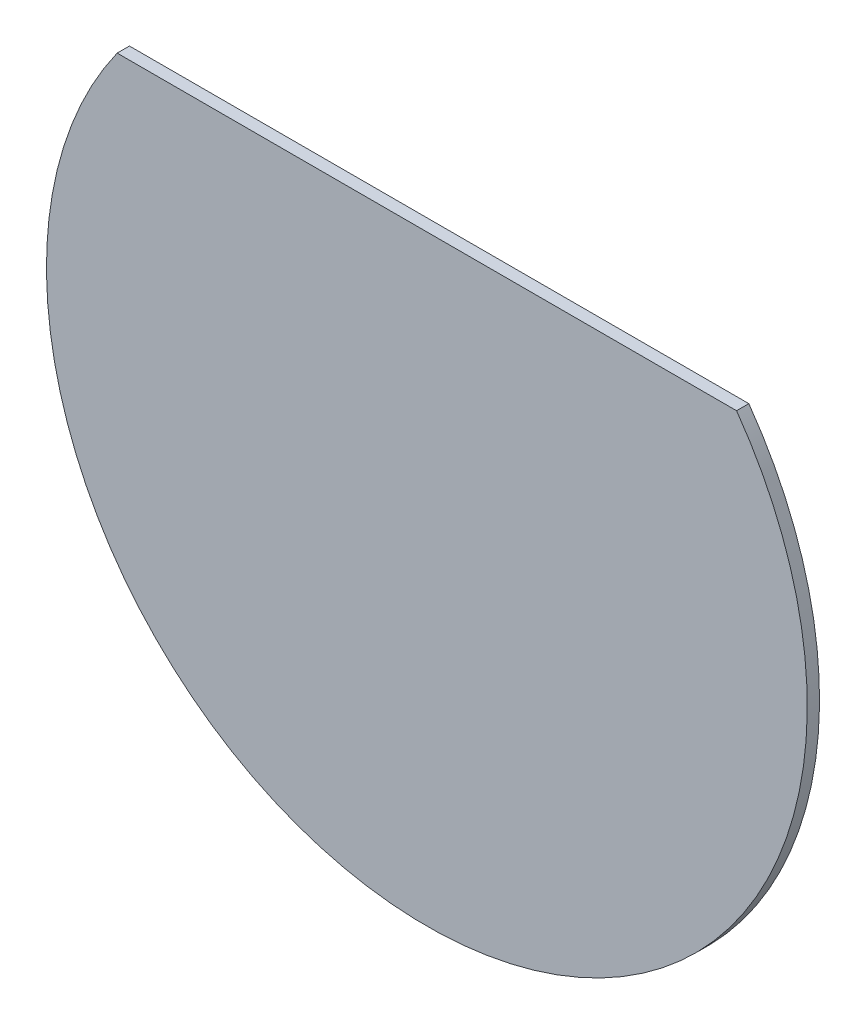
ISO-10303-21;
HEADER;
FILE_DESCRIPTION(('STEP AP214'),'2;1');
FILE_NAME('part.step','',(''),(''),'','','');
FILE_SCHEMA(('AUTOMOTIVE_DESIGN { 1 0 10303 214 1 1 1 1 }'));
ENDSEC;
DATA;
#1=APPLICATION_CONTEXT('core data for automotive mechanical design processes');
#2=APPLICATION_PROTOCOL_DEFINITION('international standard','automotive_design',2000,#1);
#3=PRODUCT_CONTEXT('',#1,'mechanical');
#4=PRODUCT('Part','Part','',(#3));
#5=PRODUCT_RELATED_PRODUCT_CATEGORY('part','',(#4));
#6=PRODUCT_DEFINITION_FORMATION('','',#4);
#7=PRODUCT_DEFINITION_CONTEXT('part definition',#1,'design');
#8=PRODUCT_DEFINITION('design','',#6,#7);
#9=PRODUCT_DEFINITION_SHAPE('','',#8);
#10=(LENGTH_UNIT() NAMED_UNIT(*) SI_UNIT(.MILLI.,.METRE.));
#11=(NAMED_UNIT(*) PLANE_ANGLE_UNIT() SI_UNIT($,.RADIAN.));
#12=(NAMED_UNIT(*) SI_UNIT($,.STERADIAN.) SOLID_ANGLE_UNIT());
#13=UNCERTAINTY_MEASURE_WITH_UNIT(LENGTH_MEASURE(1.E-05),#10,'distance_accuracy_value','');
#14=(GEOMETRIC_REPRESENTATION_CONTEXT(3) GLOBAL_UNCERTAINTY_ASSIGNED_CONTEXT((#13)) GLOBAL_UNIT_ASSIGNED_CONTEXT((#10,
#11,#12)) REPRESENTATION_CONTEXT('',''));
#15=CARTESIAN_POINT('',(0.,0.,0.));
#16=DIRECTION('',(0.,0.,1.));
#17=DIRECTION('',(1.,0.,0.));
#18=AXIS2_PLACEMENT_3D('',#15,#16,#17);
#19=CARTESIAN_POINT('',(0.,0.,5.));
#20=DIRECTION('',(0.,0.,-1.));
#21=DIRECTION('',(-1.,0.,0.));
#22=AXIS2_PLACEMENT_3D('',#19,#20,#21);
#23=CYLINDRICAL_SURFACE('',#22,155.);
#24=CARTESIAN_POINT('',(0.,0.,0.));
#25=DIRECTION('',(0.,0.,1.));
#26=DIRECTION('',(1.,0.,0.));
#27=AXIS2_PLACEMENT_3D('',#24,#25,#26);
#28=CIRCLE('',#27,155.);
#29=CARTESIAN_POINT('',(-126.19429464124,90.,0.));
#30=VERTEX_POINT('',#29);
#31=CARTESIAN_POINT('',(126.19429464124,90.,0.));
#32=VERTEX_POINT('',#31);
#33=EDGE_CURVE('E62',#30,#32,#28,.T.);
#34=ORIENTED_EDGE('',*,*,#33,.T.);
#35=DIRECTION('',(0.,0.,-1.));
#36=VECTOR('',#35,1.);
#37=CARTESIAN_POINT('',(126.19429464124,90.,5.));
#38=LINE('',#37,#36);
#39=CARTESIAN_POINT('',(126.19429464124,90.,5.));
#40=VERTEX_POINT('',#39);
#41=EDGE_CURVE('E11',#40,#32,#38,.T.);
#42=ORIENTED_EDGE('',*,*,#41,.F.);
#43=CARTESIAN_POINT('',(0.,0.,5.));
#44=DIRECTION('',(0.,0.,1.));
#45=DIRECTION('',(1.,0.,0.));
#46=AXIS2_PLACEMENT_3D('',#43,#44,#45);
#47=CIRCLE('',#46,155.);
#48=CARTESIAN_POINT('',(-126.19429464124,90.,5.));
#49=VERTEX_POINT('',#48);
#50=EDGE_CURVE('E61',#49,#40,#47,.T.);
#51=ORIENTED_EDGE('',*,*,#50,.F.);
#52=DIRECTION('',(0.,0.,-1.));
#53=VECTOR('',#52,1.);
#54=CARTESIAN_POINT('',(-126.19429464124,90.,5.));
#55=LINE('',#54,#53);
#56=EDGE_CURVE('E39',#49,#30,#55,.T.);
#57=ORIENTED_EDGE('',*,*,#56,.T.);
#58=EDGE_LOOP('',(#34,#42,#51,#57));
#59=FACE_BOUND('',#58,.T.);
#60=ADVANCED_FACE('F31',(#59),#23,.T.);
#61=CARTESIAN_POINT('',(-126.19429464124,90.,5.));
#62=DIRECTION('',(0.,-1.,0.));
#63=DIRECTION('',(0.,0.,-1.));
#64=AXIS2_PLACEMENT_3D('',#61,#62,#63);
#65=PLANE('',#64);
#66=DIRECTION('',(-1.,0.,0.));
#67=VECTOR('',#66,1.);
#68=CARTESIAN_POINT('',(-126.19429464124,90.,0.));
#69=LINE('',#68,#67);
#70=EDGE_CURVE('E54',#32,#30,#69,.T.);
#71=ORIENTED_EDGE('',*,*,#70,.T.);
#72=ORIENTED_EDGE('',*,*,#56,.F.);
#73=DIRECTION('',(-1.,0.,0.));
#74=VECTOR('',#73,1.);
#75=CARTESIAN_POINT('',(-126.19429464124,90.,5.));
#76=LINE('',#75,#74);
#77=EDGE_CURVE('E46',#40,#49,#76,.T.);
#78=ORIENTED_EDGE('',*,*,#77,.F.);
#79=ORIENTED_EDGE('',*,*,#41,.T.);
#80=EDGE_LOOP('',(#71,#72,#78,#79));
#81=FACE_BOUND('',#80,.T.);
#82=ADVANCED_FACE('F57',(#81),#65,.F.);
#83=CARTESIAN_POINT('',(0.,0.,5.));
#84=DIRECTION('',(0.,0.,1.));
#85=DIRECTION('',(1.,0.,0.));
#86=AXIS2_PLACEMENT_3D('',#83,#84,#85);
#87=PLANE('',#86);
#88=ORIENTED_EDGE('',*,*,#50,.T.);
#89=ORIENTED_EDGE('',*,*,#77,.T.);
#90=EDGE_LOOP('',(#88,#89));
#91=FACE_BOUND('',#90,.T.);
#92=ADVANCED_FACE('F69',(#91),#87,.T.);
#93=CARTESIAN_POINT('',(0.,0.,0.));
#94=DIRECTION('',(0.,0.,1.));
#95=DIRECTION('',(1.,0.,0.));
#96=AXIS2_PLACEMENT_3D('',#93,#94,#95);
#97=PLANE('',#96);
#98=ORIENTED_EDGE('',*,*,#33,.F.);
#99=ORIENTED_EDGE('',*,*,#70,.F.);
#100=EDGE_LOOP('',(#98,#99));
#101=FACE_BOUND('',#100,.T.);
#102=ADVANCED_FACE('F65',(#101),#97,.F.);
#103=CLOSED_SHELL('',(#60,#82,#92,#102));
#104=MANIFOLD_SOLID_BREP('B2',#103);
#105=ADVANCED_BREP_SHAPE_REPRESENTATION('',(#18,#104),#14);
#106=SHAPE_DEFINITION_REPRESENTATION(#9,#105);
ENDSEC;
END-ISO-10303-21;
